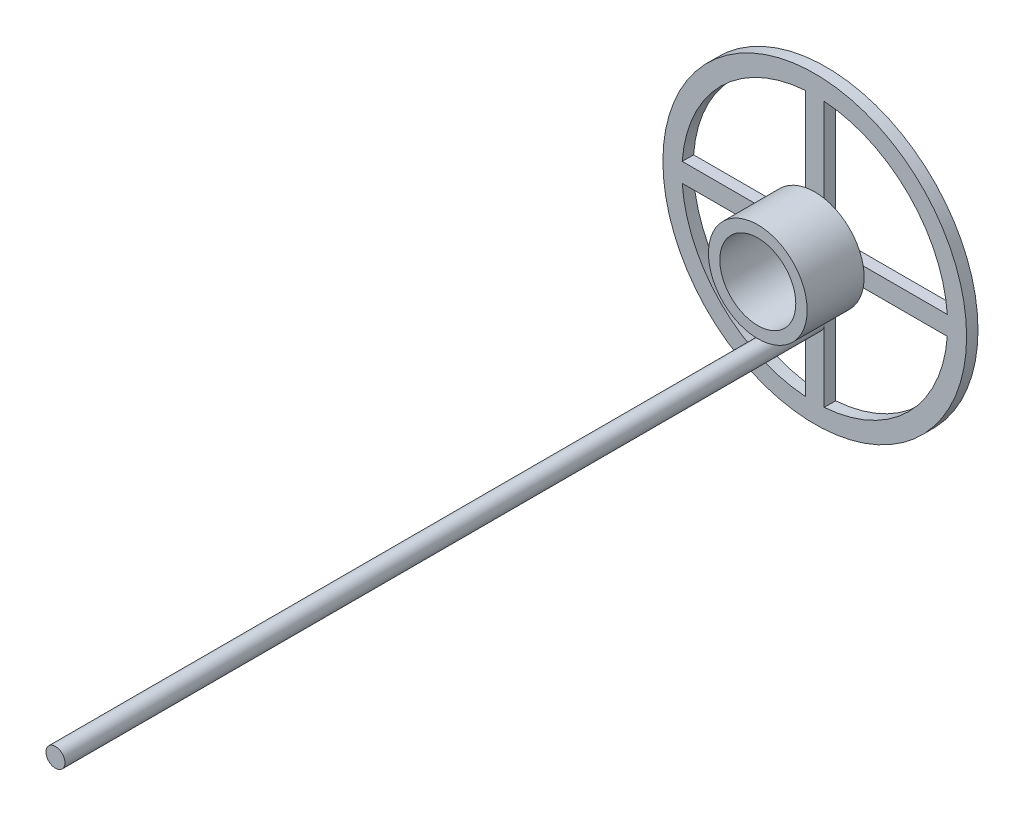
ISO-10303-21;
HEADER;
FILE_DESCRIPTION(('STEP AP214'),'2;1');
FILE_NAME('part.step','',(''),(''),'','','');
FILE_SCHEMA(('AUTOMOTIVE_DESIGN { 1 0 10303 214 1 1 1 1 }'));
ENDSEC;
DATA;
#1=APPLICATION_CONTEXT('core data for automotive mechanical design processes');
#2=APPLICATION_PROTOCOL_DEFINITION('international standard','automotive_design',2000,#1);
#3=PRODUCT_CONTEXT('',#1,'mechanical');
#4=PRODUCT('Part','Part','',(#3));
#5=PRODUCT_RELATED_PRODUCT_CATEGORY('part','',(#4));
#6=PRODUCT_DEFINITION_FORMATION('','',#4);
#7=PRODUCT_DEFINITION_CONTEXT('part definition',#1,'design');
#8=PRODUCT_DEFINITION('design','',#6,#7);
#9=PRODUCT_DEFINITION_SHAPE('','',#8);
#10=(LENGTH_UNIT() NAMED_UNIT(*) SI_UNIT(.MILLI.,.METRE.));
#11=(NAMED_UNIT(*) PLANE_ANGLE_UNIT() SI_UNIT($,.RADIAN.));
#12=(NAMED_UNIT(*) SI_UNIT($,.STERADIAN.) SOLID_ANGLE_UNIT());
#13=UNCERTAINTY_MEASURE_WITH_UNIT(LENGTH_MEASURE(1.E-05),#10,'distance_accuracy_value','');
#14=(GEOMETRIC_REPRESENTATION_CONTEXT(3) GLOBAL_UNCERTAINTY_ASSIGNED_CONTEXT((#13)) GLOBAL_UNIT_ASSIGNED_CONTEXT((#10,
#11,#12)) REPRESENTATION_CONTEXT('',''));
#15=CARTESIAN_POINT('',(0.,0.,0.));
#16=DIRECTION('',(0.,0.,1.));
#17=DIRECTION('',(1.,0.,0.));
#18=AXIS2_PLACEMENT_3D('',#15,#16,#17);
#19=CARTESIAN_POINT('',(0.,-160.,2030.));
#20=DIRECTION('',(0.,0.,-1.));
#21=DIRECTION('',(-1.,0.,0.));
#22=AXIS2_PLACEMENT_3D('',#19,#20,#21);
#23=CYLINDRICAL_SURFACE('',#22,25.);
#24=CARTESIAN_POINT('',(0.,-160.,2030.));
#25=DIRECTION('',(0.,0.,1.));
#26=DIRECTION('',(1.,0.,0.));
#27=AXIS2_PLACEMENT_3D('',#24,#25,#26);
#28=CIRCLE('',#27,25.);
#29=CARTESIAN_POINT('',(25.,-160.,2030.));
#30=VERTEX_POINT('',#29);
#31=EDGE_CURVE('E11',#30,#30,#28,.T.);
#32=ORIENTED_EDGE('',*,*,#31,.F.);
#33=EDGE_LOOP('',(#32));
#34=FACE_BOUND('',#33,.T.);
#35=CARTESIAN_POINT('',(0.,-160.,30.));
#36=DIRECTION('',(0.,0.,1.));
#37=DIRECTION('',(1.,0.,0.));
#38=AXIS2_PLACEMENT_3D('',#35,#36,#37);
#39=CIRCLE('',#38,25.);
#40=CARTESIAN_POINT('',(25.,-160.,30.));
#41=VERTEX_POINT('',#40);
#42=EDGE_CURVE('E52',#41,#41,#39,.T.);
#43=ORIENTED_EDGE('',*,*,#42,.T.);
#44=EDGE_LOOP('',(#43));
#45=FACE_BOUND('',#44,.T.);
#46=ADVANCED_FACE('F49',(#34,#45),#23,.T.);
#47=CARTESIAN_POINT('',(0.,-160.,2030.));
#48=DIRECTION('',(0.,0.,1.));
#49=DIRECTION('',(1.,0.,0.));
#50=AXIS2_PLACEMENT_3D('',#47,#48,#49);
#51=PLANE('',#50);
#52=ORIENTED_EDGE('',*,*,#31,.T.);
#53=EDGE_LOOP('',(#52));
#54=FACE_BOUND('',#53,.T.);
#55=ADVANCED_FACE('F64',(#54),#51,.T.);
#56=CARTESIAN_POINT('',(0.,-160.,30.));
#57=DIRECTION('',(0.,0.,1.));
#58=DIRECTION('',(1.,0.,0.));
#59=AXIS2_PLACEMENT_3D('',#56,#57,#58);
#60=PLANE('',#59);
#61=ORIENTED_EDGE('',*,*,#42,.F.);
#62=EDGE_LOOP('',(#61));
#63=FACE_BOUND('',#62,.T.);
#64=ADVANCED_FACE('F62',(#63),#60,.F.);
#65=CLOSED_SHELL('',(#46,#55,#64));
#66=MANIFOLD_SOLID_BREP('B2',#65);
#67=CARTESIAN_POINT('',(0.,0.,30.));
#68=DIRECTION('',(0.,0.,1.));
#69=DIRECTION('',(1.,0.,0.));
#70=AXIS2_PLACEMENT_3D('',#67,#68,#69);
#71=PLANE('',#70);
#72=DIRECTION('',(0.,-1.,0.));
#73=VECTOR('',#72,1.);
#74=CARTESIAN_POINT('',(25.,25.,30.));
#75=LINE('',#74,#73);
#76=CARTESIAN_POINT('',(25.,96.8245836551854,30.));
#77=VERTEX_POINT('',#76);
#78=CARTESIAN_POINT('',(25.,25.,30.));
#79=VERTEX_POINT('',#78);
#80=EDGE_CURVE('E394',#77,#79,#75,.T.);
#81=ORIENTED_EDGE('',*,*,#80,.F.);
#82=CARTESIAN_POINT('',(0.,0.,30.));
#83=DIRECTION('',(0.,0.,1.));
#84=DIRECTION('',(1.,0.,0.));
#85=AXIS2_PLACEMENT_3D('',#82,#83,#84);
#86=CIRCLE('',#85,100.);
#87=CARTESIAN_POINT('',(-25.,96.8245836551854,30.));
#88=VERTEX_POINT('',#87);
#89=EDGE_CURVE('E242',#77,#88,#86,.T.);
#90=ORIENTED_EDGE('',*,*,#89,.T.);
#91=DIRECTION('',(0.,1.,0.));
#92=VECTOR('',#91,1.);
#93=CARTESIAN_POINT('',(-25.,25.,30.));
#94=LINE('',#93,#92);
#95=CARTESIAN_POINT('',(-25.,25.,30.));
#96=VERTEX_POINT('',#95);
#97=EDGE_CURVE('E297',#96,#88,#94,.T.);
#98=ORIENTED_EDGE('',*,*,#97,.F.);
#99=DIRECTION('',(1.,0.,0.));
#100=VECTOR('',#99,1.);
#101=CARTESIAN_POINT('',(-25.,25.,30.));
#102=LINE('',#101,#100);
#103=CARTESIAN_POINT('',(-96.8245836551854,25.,30.));
#104=VERTEX_POINT('',#103);
#105=EDGE_CURVE('E290',#104,#96,#102,.T.);
#106=ORIENTED_EDGE('',*,*,#105,.F.);
#107=CARTESIAN_POINT('',(-96.8245836551854,-24.9999999999999,30.));
#108=VERTEX_POINT('',#107);
#109=EDGE_CURVE('E414',#104,#108,#86,.T.);
#110=ORIENTED_EDGE('',*,*,#109,.T.);
#111=DIRECTION('',(-1.,0.,0.));
#112=VECTOR('',#111,1.);
#113=CARTESIAN_POINT('',(-25.,-25.,30.));
#114=LINE('',#113,#112);
#115=CARTESIAN_POINT('',(-25.,-25.,30.));
#116=VERTEX_POINT('',#115);
#117=EDGE_CURVE('E354',#116,#108,#114,.T.);
#118=ORIENTED_EDGE('',*,*,#117,.F.);
#119=DIRECTION('',(0.,1.,0.));
#120=VECTOR('',#119,1.);
#121=CARTESIAN_POINT('',(-25.,-349.106001094224,30.));
#122=LINE('',#121,#120);
#123=CARTESIAN_POINT('',(-25.,-96.8245836551854,30.));
#124=VERTEX_POINT('',#123);
#125=EDGE_CURVE('E347',#124,#116,#122,.T.);
#126=ORIENTED_EDGE('',*,*,#125,.F.);
#127=CARTESIAN_POINT('',(25.,-96.8245836551854,30.));
#128=VERTEX_POINT('',#127);
#129=EDGE_CURVE('E376',#124,#128,#86,.T.);
#130=ORIENTED_EDGE('',*,*,#129,.T.);
#131=DIRECTION('',(0.,-1.,0.));
#132=VECTOR('',#131,1.);
#133=CARTESIAN_POINT('',(25.,-349.106001094224,30.));
#134=LINE('',#133,#132);
#135=CARTESIAN_POINT('',(25.,-25.,30.));
#136=VERTEX_POINT('',#135);
#137=EDGE_CURVE('E325',#136,#128,#134,.T.);
#138=ORIENTED_EDGE('',*,*,#137,.F.);
#139=DIRECTION('',(-1.,0.,0.));
#140=VECTOR('',#139,1.);
#141=CARTESIAN_POINT('',(349.106001094224,-24.9999999999999,30.));
#142=LINE('',#141,#140);
#143=CARTESIAN_POINT('',(96.8245836551854,-24.9999999999999,30.));
#144=VERTEX_POINT('',#143);
#145=EDGE_CURVE('E319',#144,#136,#142,.T.);
#146=ORIENTED_EDGE('',*,*,#145,.F.);
#147=CARTESIAN_POINT('',(96.8245836551854,25.,30.));
#148=VERTEX_POINT('',#147);
#149=EDGE_CURVE('E374',#144,#148,#86,.T.);
#150=ORIENTED_EDGE('',*,*,#149,.T.);
#151=DIRECTION('',(1.,0.,0.));
#152=VECTOR('',#151,1.);
#153=CARTESIAN_POINT('',(349.106001094224,25.,30.));
#154=LINE('',#153,#152);
#155=EDGE_CURVE('E262',#79,#148,#154,.T.);
#156=ORIENTED_EDGE('',*,*,#155,.F.);
#157=EDGE_LOOP('',(#81,#90,#98,#106,#110,#118,#126,#130,#138,#146,#150,#156));
#158=FACE_BOUND('',#157,.T.);
#159=ADVANCED_FACE('F90',(#158),#71,.T.);
#160=CARTESIAN_POINT('',(0.,0.,30.));
#161=DIRECTION('',(0.,0.,1.));
#162=DIRECTION('',(1.,0.,0.));
#163=AXIS2_PLACEMENT_3D('',#160,#161,#162);
#164=CIRCLE('',#163,130.);
#165=CARTESIAN_POINT('',(25.,127.573508221731,30.));
#166=VERTEX_POINT('',#165);
#167=CARTESIAN_POINT('',(-25.,127.573508221731,30.));
#168=VERTEX_POINT('',#167);
#169=EDGE_CURVE('E47',#166,#168,#164,.T.);
#170=ORIENTED_EDGE('',*,*,#169,.F.);
#171=CARTESIAN_POINT('',(25.0000000000001,349.106001094224,30.));
#172=VERTEX_POINT('',#171);
#173=EDGE_CURVE('E260',#172,#166,#75,.T.);
#174=ORIENTED_EDGE('',*,*,#173,.F.);
#175=CARTESIAN_POINT('',(0.,0.,30.));
#176=DIRECTION('',(0.,0.,1.));
#177=DIRECTION('',(1.,0.,0.));
#178=AXIS2_PLACEMENT_3D('',#175,#176,#177);
#179=CIRCLE('',#178,350.);
#180=CARTESIAN_POINT('',(349.106001094224,25.,30.));
#181=VERTEX_POINT('',#180);
#182=EDGE_CURVE('E256',#181,#172,#179,.T.);
#183=ORIENTED_EDGE('',*,*,#182,.F.);
#184=CARTESIAN_POINT('',(127.573508221731,25.,30.));
#185=VERTEX_POINT('',#184);
#186=EDGE_CURVE('E252',#185,#181,#154,.T.);
#187=ORIENTED_EDGE('',*,*,#186,.F.);
#188=CARTESIAN_POINT('',(127.573508221731,-24.9999999999999,30.));
#189=VERTEX_POINT('',#188);
#190=EDGE_CURVE('E230',#189,#185,#164,.T.);
#191=ORIENTED_EDGE('',*,*,#190,.F.);
#192=CARTESIAN_POINT('',(349.106001094224,-24.9999999999999,30.));
#193=VERTEX_POINT('',#192);
#194=EDGE_CURVE('E321',#193,#189,#142,.T.);
#195=ORIENTED_EDGE('',*,*,#194,.F.);
#196=CARTESIAN_POINT('',(0.,0.,30.));
#197=DIRECTION('',(0.,0.,1.));
#198=DIRECTION('',(1.,0.,0.));
#199=AXIS2_PLACEMENT_3D('',#196,#197,#198);
#200=CIRCLE('',#199,350.);
#201=CARTESIAN_POINT('',(25.,-349.106001094224,30.));
#202=VERTEX_POINT('',#201);
#203=EDGE_CURVE('E317',#202,#193,#200,.T.);
#204=ORIENTED_EDGE('',*,*,#203,.F.);
#205=CARTESIAN_POINT('',(25.,-127.573508221731,30.));
#206=VERTEX_POINT('',#205);
#207=EDGE_CURVE('E323',#206,#202,#134,.T.);
#208=ORIENTED_EDGE('',*,*,#207,.F.);
#209=CARTESIAN_POINT('',(-25.,-127.573508221731,30.));
#210=VERTEX_POINT('',#209);
#211=EDGE_CURVE('E241',#210,#206,#164,.T.);
#212=ORIENTED_EDGE('',*,*,#211,.F.);
#213=CARTESIAN_POINT('',(-25.,-349.106001094224,30.));
#214=VERTEX_POINT('',#213);
#215=EDGE_CURVE('E349',#214,#210,#122,.T.);
#216=ORIENTED_EDGE('',*,*,#215,.F.);
#217=CARTESIAN_POINT('',(0.,0.,30.));
#218=DIRECTION('',(0.,0.,1.));
#219=DIRECTION('',(1.,0.,0.));
#220=AXIS2_PLACEMENT_3D('',#217,#218,#219);
#221=CIRCLE('',#220,350.);
#222=CARTESIAN_POINT('',(-349.106001094224,-24.9999999999999,30.));
#223=VERTEX_POINT('',#222);
#224=EDGE_CURVE('E345',#223,#214,#221,.T.);
#225=ORIENTED_EDGE('',*,*,#224,.F.);
#226=CARTESIAN_POINT('',(-127.573508221731,-24.9999999999999,30.));
#227=VERTEX_POINT('',#226);
#228=EDGE_CURVE('E352',#227,#223,#114,.T.);
#229=ORIENTED_EDGE('',*,*,#228,.F.);
#230=CARTESIAN_POINT('',(-127.573508221731,25.,30.));
#231=VERTEX_POINT('',#230);
#232=EDGE_CURVE('E99',#231,#227,#164,.T.);
#233=ORIENTED_EDGE('',*,*,#232,.F.);
#234=CARTESIAN_POINT('',(-349.106001094224,24.9999999999999,30.));
#235=VERTEX_POINT('',#234);
#236=EDGE_CURVE('E292',#235,#231,#102,.T.);
#237=ORIENTED_EDGE('',*,*,#236,.F.);
#238=CARTESIAN_POINT('',(0.,0.,30.));
#239=DIRECTION('',(0.,0.,1.));
#240=DIRECTION('',(1.,0.,0.));
#241=AXIS2_PLACEMENT_3D('',#238,#239,#240);
#242=CIRCLE('',#241,350.);
#243=CARTESIAN_POINT('',(-25.0000000000001,349.106001094224,30.));
#244=VERTEX_POINT('',#243);
#245=EDGE_CURVE('E288',#244,#235,#242,.T.);
#246=ORIENTED_EDGE('',*,*,#245,.F.);
#247=EDGE_CURVE('E295',#168,#244,#94,.T.);
#248=ORIENTED_EDGE('',*,*,#247,.F.);
#249=EDGE_LOOP('',(#170,#174,#183,#187,#191,#195,#204,#208,#212,#216,#225,#229,#233,#237,#246,#248));
#250=FACE_BOUND('',#249,.T.);
#251=CARTESIAN_POINT('',(0.,0.,30.));
#252=DIRECTION('',(0.,0.,1.));
#253=DIRECTION('',(1.,0.,0.));
#254=AXIS2_PLACEMENT_3D('',#251,#252,#253);
#255=CIRCLE('',#254,400.);
#256=CARTESIAN_POINT('',(400.,0.,30.));
#257=VERTEX_POINT('',#256);
#258=EDGE_CURVE('E372',#257,#257,#255,.T.);
#259=ORIENTED_EDGE('',*,*,#258,.T.);
#260=EDGE_LOOP('',(#259));
#261=FACE_BOUND('',#260,.T.);
#262=ADVANCED_FACE('F253',(#250,#261),#71,.T.);
#263=CARTESIAN_POINT('',(0.,0.,0.));
#264=DIRECTION('',(0.,0.,1.));
#265=DIRECTION('',(1.,0.,0.));
#266=AXIS2_PLACEMENT_3D('',#263,#264,#265);
#267=PLANE('',#266);
#268=CARTESIAN_POINT('',(0.,0.,0.));
#269=DIRECTION('',(0.,0.,1.));
#270=DIRECTION('',(1.,0.,0.));
#271=AXIS2_PLACEMENT_3D('',#268,#269,#270);
#272=CIRCLE('',#271,350.);
#273=CARTESIAN_POINT('',(-25.0000000000001,349.106001094224,0.));
#274=VERTEX_POINT('',#273);
#275=CARTESIAN_POINT('',(-349.106001094224,24.9999999999999,0.));
#276=VERTEX_POINT('',#275);
#277=EDGE_CURVE('E287',#274,#276,#272,.T.);
#278=ORIENTED_EDGE('',*,*,#277,.T.);
#279=DIRECTION('',(1.,0.,0.));
#280=VECTOR('',#279,1.);
#281=CARTESIAN_POINT('',(-25.,25.,0.));
#282=LINE('',#281,#280);
#283=CARTESIAN_POINT('',(-25.,25.,0.));
#284=VERTEX_POINT('',#283);
#285=EDGE_CURVE('E304',#276,#284,#282,.T.);
#286=ORIENTED_EDGE('',*,*,#285,.T.);
#287=DIRECTION('',(0.,1.,0.));
#288=VECTOR('',#287,1.);
#289=CARTESIAN_POINT('',(-25.,25.,0.));
#290=LINE('',#289,#288);
#291=EDGE_CURVE('E291',#284,#274,#290,.T.);
#292=ORIENTED_EDGE('',*,*,#291,.T.);
#293=EDGE_LOOP('',(#278,#286,#292));
#294=FACE_BOUND('',#293,.T.);
#295=CARTESIAN_POINT('',(0.,0.,0.));
#296=DIRECTION('',(0.,0.,1.));
#297=DIRECTION('',(1.,0.,0.));
#298=AXIS2_PLACEMENT_3D('',#295,#296,#297);
#299=CIRCLE('',#298,350.);
#300=CARTESIAN_POINT('',(-349.106001094224,-24.9999999999999,0.));
#301=VERTEX_POINT('',#300);
#302=CARTESIAN_POINT('',(-25.,-349.106001094224,0.));
#303=VERTEX_POINT('',#302);
#304=EDGE_CURVE('E344',#301,#303,#299,.T.);
#305=ORIENTED_EDGE('',*,*,#304,.T.);
#306=DIRECTION('',(0.,1.,0.));
#307=VECTOR('',#306,1.);
#308=CARTESIAN_POINT('',(-25.,-349.106001094224,0.));
#309=LINE('',#308,#307);
#310=CARTESIAN_POINT('',(-25.,-25.,0.));
#311=VERTEX_POINT('',#310);
#312=EDGE_CURVE('E361',#303,#311,#309,.T.);
#313=ORIENTED_EDGE('',*,*,#312,.T.);
#314=DIRECTION('',(-1.,0.,0.));
#315=VECTOR('',#314,1.);
#316=CARTESIAN_POINT('',(-25.,-25.,0.));
#317=LINE('',#316,#315);
#318=EDGE_CURVE('E348',#311,#301,#317,.T.);
#319=ORIENTED_EDGE('',*,*,#318,.T.);
#320=EDGE_LOOP('',(#305,#313,#319));
#321=FACE_BOUND('',#320,.T.);
#322=CARTESIAN_POINT('',(0.,0.,0.));
#323=DIRECTION('',(0.,0.,1.));
#324=DIRECTION('',(1.,0.,0.));
#325=AXIS2_PLACEMENT_3D('',#322,#323,#324);
#326=CIRCLE('',#325,400.);
#327=CARTESIAN_POINT('',(400.,0.,0.));
#328=VERTEX_POINT('',#327);
#329=EDGE_CURVE('E94',#328,#328,#326,.T.);
#330=ORIENTED_EDGE('',*,*,#329,.F.);
#331=EDGE_LOOP('',(#330));
#332=FACE_BOUND('',#331,.T.);
#333=CARTESIAN_POINT('',(0.,0.,0.));
#334=DIRECTION('',(0.,0.,1.));
#335=DIRECTION('',(1.,0.,0.));
#336=AXIS2_PLACEMENT_3D('',#333,#334,#335);
#337=CIRCLE('',#336,350.);
#338=CARTESIAN_POINT('',(25.,-349.106001094224,0.));
#339=VERTEX_POINT('',#338);
#340=CARTESIAN_POINT('',(349.106001094224,-24.9999999999999,0.));
#341=VERTEX_POINT('',#340);
#342=EDGE_CURVE('E316',#339,#341,#337,.T.);
#343=ORIENTED_EDGE('',*,*,#342,.T.);
#344=DIRECTION('',(-1.,0.,0.));
#345=VECTOR('',#344,1.);
#346=CARTESIAN_POINT('',(349.106001094224,-24.9999999999999,0.));
#347=LINE('',#346,#345);
#348=CARTESIAN_POINT('',(25.,-25.,0.));
#349=VERTEX_POINT('',#348);
#350=EDGE_CURVE('E332',#341,#349,#347,.T.);
#351=ORIENTED_EDGE('',*,*,#350,.T.);
#352=DIRECTION('',(0.,-1.,0.));
#353=VECTOR('',#352,1.);
#354=CARTESIAN_POINT('',(25.,-349.106001094224,0.));
#355=LINE('',#354,#353);
#356=EDGE_CURVE('E320',#349,#339,#355,.T.);
#357=ORIENTED_EDGE('',*,*,#356,.T.);
#358=EDGE_LOOP('',(#343,#351,#357));
#359=FACE_BOUND('',#358,.T.);
#360=CARTESIAN_POINT('',(0.,0.,0.));
#361=DIRECTION('',(0.,0.,1.));
#362=DIRECTION('',(1.,0.,0.));
#363=AXIS2_PLACEMENT_3D('',#360,#361,#362);
#364=CIRCLE('',#363,350.);
#365=CARTESIAN_POINT('',(349.106001094224,25.,0.));
#366=VERTEX_POINT('',#365);
#367=CARTESIAN_POINT('',(25.0000000000001,349.106001094224,0.));
#368=VERTEX_POINT('',#367);
#369=EDGE_CURVE('E272',#366,#368,#364,.T.);
#370=ORIENTED_EDGE('',*,*,#369,.T.);
#371=DIRECTION('',(0.,-1.,0.));
#372=VECTOR('',#371,1.);
#373=CARTESIAN_POINT('',(25.,25.,0.));
#374=LINE('',#373,#372);
#375=CARTESIAN_POINT('',(25.,25.,0.));
#376=VERTEX_POINT('',#375);
#377=EDGE_CURVE('E275',#368,#376,#374,.T.);
#378=ORIENTED_EDGE('',*,*,#377,.T.);
#379=DIRECTION('',(1.,0.,0.));
#380=VECTOR('',#379,1.);
#381=CARTESIAN_POINT('',(349.106001094224,25.,0.));
#382=LINE('',#381,#380);
#383=EDGE_CURVE('E278',#376,#366,#382,.T.);
#384=ORIENTED_EDGE('',*,*,#383,.T.);
#385=EDGE_LOOP('',(#370,#378,#384));
#386=FACE_BOUND('',#385,.T.);
#387=ADVANCED_FACE('F382',(#294,#321,#332,#359,#386),#267,.F.);
#388=CARTESIAN_POINT('',(0.,0.,30.));
#389=DIRECTION('',(0.,0.,-1.));
#390=DIRECTION('',(-1.,0.,0.));
#391=AXIS2_PLACEMENT_3D('',#388,#389,#390);
#392=CYLINDRICAL_SURFACE('',#391,400.);
#393=ORIENTED_EDGE('',*,*,#258,.F.);
#394=EDGE_LOOP('',(#393));
#395=FACE_BOUND('',#394,.T.);
#396=ORIENTED_EDGE('',*,*,#329,.T.);
#397=EDGE_LOOP('',(#396));
#398=FACE_BOUND('',#397,.T.);
#399=ADVANCED_FACE('F92',(#395,#398),#392,.T.);
#400=CARTESIAN_POINT('',(0.,0.,30.));
#401=DIRECTION('',(0.,0.,-1.));
#402=DIRECTION('',(-1.,0.,0.));
#403=AXIS2_PLACEMENT_3D('',#400,#401,#402);
#404=CYLINDRICAL_SURFACE('',#403,350.);
#405=ORIENTED_EDGE('',*,*,#304,.F.);
#406=DIRECTION('',(0.,0.,-1.));
#407=VECTOR('',#406,1.);
#408=CARTESIAN_POINT('',(-349.106001094224,-24.9999999999999,30.));
#409=LINE('',#408,#407);
#410=EDGE_CURVE('E357',#223,#301,#409,.T.);
#411=ORIENTED_EDGE('',*,*,#410,.F.);
#412=ORIENTED_EDGE('',*,*,#224,.T.);
#413=DIRECTION('',(0.,0.,-1.));
#414=VECTOR('',#413,1.);
#415=CARTESIAN_POINT('',(-25.,-349.106001094224,30.));
#416=LINE('',#415,#414);
#417=EDGE_CURVE('E370',#214,#303,#416,.T.);
#418=ORIENTED_EDGE('',*,*,#417,.T.);
#419=EDGE_LOOP('',(#405,#411,#412,#418));
#420=FACE_BOUND('',#419,.T.);
#421=ADVANCED_FACE('F453',(#420),#404,.F.);
#422=CARTESIAN_POINT('',(-25.,-349.106001094224,30.));
#423=DIRECTION('',(-1.,0.,0.));
#424=DIRECTION('',(0.,-1.,0.));
#425=AXIS2_PLACEMENT_3D('',#422,#423,#424);
#426=PLANE('',#425);
#427=ORIENTED_EDGE('',*,*,#312,.F.);
#428=ORIENTED_EDGE('',*,*,#417,.F.);
#429=ORIENTED_EDGE('',*,*,#215,.T.);
#430=EDGE_CURVE('E353',#210,#124,#122,.T.);
#431=ORIENTED_EDGE('',*,*,#430,.T.);
#432=ORIENTED_EDGE('',*,*,#125,.T.);
#433=DIRECTION('',(0.,0.,-1.));
#434=VECTOR('',#433,1.);
#435=CARTESIAN_POINT('',(-25.,-25.,30.));
#436=LINE('',#435,#434);
#437=EDGE_CURVE('E368',#116,#311,#436,.T.);
#438=ORIENTED_EDGE('',*,*,#437,.T.);
#439=EDGE_LOOP('',(#427,#428,#429,#431,#432,#438));
#440=FACE_BOUND('',#439,.T.);
#441=ADVANCED_FACE('F443',(#440),#426,.T.);
#442=CARTESIAN_POINT('',(-25.,-25.,30.));
#443=DIRECTION('',(0.,-1.,0.));
#444=DIRECTION('',(1.,0.,0.));
#445=AXIS2_PLACEMENT_3D('',#442,#443,#444);
#446=PLANE('',#445);
#447=ORIENTED_EDGE('',*,*,#318,.F.);
#448=ORIENTED_EDGE('',*,*,#437,.F.);
#449=ORIENTED_EDGE('',*,*,#117,.T.);
#450=EDGE_CURVE('E358',#108,#227,#114,.T.);
#451=ORIENTED_EDGE('',*,*,#450,.T.);
#452=ORIENTED_EDGE('',*,*,#228,.T.);
#453=ORIENTED_EDGE('',*,*,#410,.T.);
#454=EDGE_LOOP('',(#447,#448,#449,#451,#452,#453));
#455=FACE_BOUND('',#454,.T.);
#456=ADVANCED_FACE('F434',(#455),#446,.T.);
#457=CARTESIAN_POINT('',(0.,0.,30.));
#458=DIRECTION('',(0.,0.,-1.));
#459=DIRECTION('',(-1.,0.,0.));
#460=AXIS2_PLACEMENT_3D('',#457,#458,#459);
#461=CYLINDRICAL_SURFACE('',#460,350.);
#462=ORIENTED_EDGE('',*,*,#342,.F.);
#463=DIRECTION('',(0.,0.,-1.));
#464=VECTOR('',#463,1.);
#465=CARTESIAN_POINT('',(25.,-349.106001094224,30.));
#466=LINE('',#465,#464);
#467=EDGE_CURVE('E328',#202,#339,#466,.T.);
#468=ORIENTED_EDGE('',*,*,#467,.F.);
#469=ORIENTED_EDGE('',*,*,#203,.T.);
#470=DIRECTION('',(0.,0.,-1.));
#471=VECTOR('',#470,1.);
#472=CARTESIAN_POINT('',(349.106001094224,-24.9999999999999,30.));
#473=LINE('',#472,#471);
#474=EDGE_CURVE('E341',#193,#341,#473,.T.);
#475=ORIENTED_EDGE('',*,*,#474,.T.);
#476=EDGE_LOOP('',(#462,#468,#469,#475));
#477=FACE_BOUND('',#476,.T.);
#478=ADVANCED_FACE('F432',(#477),#461,.F.);
#479=CARTESIAN_POINT('',(349.106001094224,-24.9999999999999,30.));
#480=DIRECTION('',(0.,-1.,0.));
#481=DIRECTION('',(1.,0.,0.));
#482=AXIS2_PLACEMENT_3D('',#479,#480,#481);
#483=PLANE('',#482);
#484=ORIENTED_EDGE('',*,*,#350,.F.);
#485=ORIENTED_EDGE('',*,*,#474,.F.);
#486=ORIENTED_EDGE('',*,*,#194,.T.);
#487=EDGE_CURVE('E324',#189,#144,#142,.T.);
#488=ORIENTED_EDGE('',*,*,#487,.T.);
#489=ORIENTED_EDGE('',*,*,#145,.T.);
#490=DIRECTION('',(0.,0.,-1.));
#491=VECTOR('',#490,1.);
#492=CARTESIAN_POINT('',(25.,-25.,30.));
#493=LINE('',#492,#491);
#494=EDGE_CURVE('E339',#136,#349,#493,.T.);
#495=ORIENTED_EDGE('',*,*,#494,.T.);
#496=EDGE_LOOP('',(#484,#485,#486,#488,#489,#495));
#497=FACE_BOUND('',#496,.T.);
#498=ADVANCED_FACE('F425',(#497),#483,.T.);
#499=CARTESIAN_POINT('',(25.,-349.106001094224,30.));
#500=DIRECTION('',(1.,0.,0.));
#501=DIRECTION('',(0.,1.,0.));
#502=AXIS2_PLACEMENT_3D('',#499,#500,#501);
#503=PLANE('',#502);
#504=ORIENTED_EDGE('',*,*,#356,.F.);
#505=ORIENTED_EDGE('',*,*,#494,.F.);
#506=ORIENTED_EDGE('',*,*,#137,.T.);
#507=EDGE_CURVE('E329',#128,#206,#134,.T.);
#508=ORIENTED_EDGE('',*,*,#507,.T.);
#509=ORIENTED_EDGE('',*,*,#207,.T.);
#510=ORIENTED_EDGE('',*,*,#467,.T.);
#511=EDGE_LOOP('',(#504,#505,#506,#508,#509,#510));
#512=FACE_BOUND('',#511,.T.);
#513=ADVANCED_FACE('F423',(#512),#503,.T.);
#514=CARTESIAN_POINT('',(0.,0.,30.));
#515=DIRECTION('',(0.,0.,-1.));
#516=DIRECTION('',(-1.,0.,0.));
#517=AXIS2_PLACEMENT_3D('',#514,#515,#516);
#518=CYLINDRICAL_SURFACE('',#517,350.);
#519=ORIENTED_EDGE('',*,*,#277,.F.);
#520=DIRECTION('',(0.,0.,-1.));
#521=VECTOR('',#520,1.);
#522=CARTESIAN_POINT('',(-25.0000000000001,349.106001094224,30.));
#523=LINE('',#522,#521);
#524=EDGE_CURVE('E300',#244,#274,#523,.T.);
#525=ORIENTED_EDGE('',*,*,#524,.F.);
#526=ORIENTED_EDGE('',*,*,#245,.T.);
#527=DIRECTION('',(0.,0.,-1.));
#528=VECTOR('',#527,1.);
#529=CARTESIAN_POINT('',(-349.106001094224,24.9999999999999,30.));
#530=LINE('',#529,#528);
#531=EDGE_CURVE('E313',#235,#276,#530,.T.);
#532=ORIENTED_EDGE('',*,*,#531,.T.);
#533=EDGE_LOOP('',(#519,#525,#526,#532));
#534=FACE_BOUND('',#533,.T.);
#535=ADVANCED_FACE('F488',(#534),#518,.F.);
#536=CARTESIAN_POINT('',(-25.,25.,30.));
#537=DIRECTION('',(0.,1.,0.));
#538=DIRECTION('',(-1.,0.,0.));
#539=AXIS2_PLACEMENT_3D('',#536,#537,#538);
#540=PLANE('',#539);
#541=ORIENTED_EDGE('',*,*,#285,.F.);
#542=ORIENTED_EDGE('',*,*,#531,.F.);
#543=ORIENTED_EDGE('',*,*,#236,.T.);
#544=EDGE_CURVE('E296',#231,#104,#102,.T.);
#545=ORIENTED_EDGE('',*,*,#544,.T.);
#546=ORIENTED_EDGE('',*,*,#105,.T.);
#547=DIRECTION('',(0.,0.,-1.));
#548=VECTOR('',#547,1.);
#549=CARTESIAN_POINT('',(-25.,25.,30.));
#550=LINE('',#549,#548);
#551=EDGE_CURVE('E311',#96,#284,#550,.T.);
#552=ORIENTED_EDGE('',*,*,#551,.T.);
#553=EDGE_LOOP('',(#541,#542,#543,#545,#546,#552));
#554=FACE_BOUND('',#553,.T.);
#555=ADVANCED_FACE('F486',(#554),#540,.T.);
#556=CARTESIAN_POINT('',(-25.,25.,30.));
#557=DIRECTION('',(-1.,0.,0.));
#558=DIRECTION('',(0.,-1.,0.));
#559=AXIS2_PLACEMENT_3D('',#556,#557,#558);
#560=PLANE('',#559);
#561=ORIENTED_EDGE('',*,*,#291,.F.);
#562=ORIENTED_EDGE('',*,*,#551,.F.);
#563=ORIENTED_EDGE('',*,*,#97,.T.);
#564=EDGE_CURVE('E301',#88,#168,#94,.T.);
#565=ORIENTED_EDGE('',*,*,#564,.T.);
#566=ORIENTED_EDGE('',*,*,#247,.T.);
#567=ORIENTED_EDGE('',*,*,#524,.T.);
#568=EDGE_LOOP('',(#561,#562,#563,#565,#566,#567));
#569=FACE_BOUND('',#568,.T.);
#570=ADVANCED_FACE('F493',(#569),#560,.T.);
#571=CARTESIAN_POINT('',(0.,0.,30.));
#572=DIRECTION('',(0.,0.,-1.));
#573=DIRECTION('',(-1.,0.,0.));
#574=AXIS2_PLACEMENT_3D('',#571,#572,#573);
#575=CYLINDRICAL_SURFACE('',#574,350.);
#576=ORIENTED_EDGE('',*,*,#369,.F.);
#577=DIRECTION('',(0.,0.,-1.));
#578=VECTOR('',#577,1.);
#579=CARTESIAN_POINT('',(349.106001094224,25.,30.));
#580=LINE('',#579,#578);
#581=EDGE_CURVE('E268',#181,#366,#580,.T.);
#582=ORIENTED_EDGE('',*,*,#581,.F.);
#583=ORIENTED_EDGE('',*,*,#182,.T.);
#584=DIRECTION('',(0.,0.,-1.));
#585=VECTOR('',#584,1.);
#586=CARTESIAN_POINT('',(25.0000000000001,349.106001094224,30.));
#587=LINE('',#586,#585);
#588=EDGE_CURVE('E284',#172,#368,#587,.T.);
#589=ORIENTED_EDGE('',*,*,#588,.T.);
#590=EDGE_LOOP('',(#576,#582,#583,#589));
#591=FACE_BOUND('',#590,.T.);
#592=ADVANCED_FACE('F388',(#591),#575,.F.);
#593=CARTESIAN_POINT('',(25.,25.,30.));
#594=DIRECTION('',(1.,0.,0.));
#595=DIRECTION('',(0.,1.,0.));
#596=AXIS2_PLACEMENT_3D('',#593,#594,#595);
#597=PLANE('',#596);
#598=ORIENTED_EDGE('',*,*,#377,.F.);
#599=ORIENTED_EDGE('',*,*,#588,.F.);
#600=ORIENTED_EDGE('',*,*,#173,.T.);
#601=EDGE_CURVE('E249',#166,#77,#75,.T.);
#602=ORIENTED_EDGE('',*,*,#601,.T.);
#603=ORIENTED_EDGE('',*,*,#80,.T.);
#604=DIRECTION('',(0.,0.,-1.));
#605=VECTOR('',#604,1.);
#606=CARTESIAN_POINT('',(25.,25.,30.));
#607=LINE('',#606,#605);
#608=EDGE_CURVE('E282',#79,#376,#607,.T.);
#609=ORIENTED_EDGE('',*,*,#608,.T.);
#610=EDGE_LOOP('',(#598,#599,#600,#602,#603,#609));
#611=FACE_BOUND('',#610,.T.);
#612=ADVANCED_FACE('F478',(#611),#597,.T.);
#613=CARTESIAN_POINT('',(349.106001094224,25.,30.));
#614=DIRECTION('',(0.,1.,0.));
#615=DIRECTION('',(-1.,0.,0.));
#616=AXIS2_PLACEMENT_3D('',#613,#614,#615);
#617=PLANE('',#616);
#618=ORIENTED_EDGE('',*,*,#383,.F.);
#619=ORIENTED_EDGE('',*,*,#608,.F.);
#620=ORIENTED_EDGE('',*,*,#155,.T.);
#621=EDGE_CURVE('E246',#148,#185,#154,.T.);
#622=ORIENTED_EDGE('',*,*,#621,.T.);
#623=ORIENTED_EDGE('',*,*,#186,.T.);
#624=ORIENTED_EDGE('',*,*,#581,.T.);
#625=EDGE_LOOP('',(#618,#619,#620,#622,#623,#624));
#626=FACE_BOUND('',#625,.T.);
#627=ADVANCED_FACE('F265',(#626),#617,.T.);
#628=CARTESIAN_POINT('',(0.,0.,30.));
#629=DIRECTION('',(0.,0.,1.));
#630=DIRECTION('',(1.,0.,0.));
#631=AXIS2_PLACEMENT_3D('',#628,#629,#630);
#632=PLANE('',#631);
#633=ORIENTED_EDGE('',*,*,#430,.F.);
#634=EDGE_CURVE('E474',#227,#210,#164,.T.);
#635=ORIENTED_EDGE('',*,*,#634,.F.);
#636=ORIENTED_EDGE('',*,*,#450,.F.);
#637=EDGE_CURVE('E406',#108,#124,#86,.T.);
#638=ORIENTED_EDGE('',*,*,#637,.T.);
#639=EDGE_LOOP('',(#633,#635,#636,#638));
#640=FACE_BOUND('',#639,.T.);
#641=ADVANCED_FACE('F472',(#640),#632,.F.);
#642=ORIENTED_EDGE('',*,*,#487,.F.);
#643=EDGE_CURVE('E236',#206,#189,#164,.T.);
#644=ORIENTED_EDGE('',*,*,#643,.F.);
#645=ORIENTED_EDGE('',*,*,#507,.F.);
#646=EDGE_CURVE('E400',#128,#144,#86,.T.);
#647=ORIENTED_EDGE('',*,*,#646,.T.);
#648=EDGE_LOOP('',(#642,#644,#645,#647));
#649=FACE_BOUND('',#648,.T.);
#650=ADVANCED_FACE('F403',(#649),#632,.F.);
#651=ORIENTED_EDGE('',*,*,#544,.F.);
#652=EDGE_CURVE('E101',#168,#231,#164,.T.);
#653=ORIENTED_EDGE('',*,*,#652,.F.);
#654=ORIENTED_EDGE('',*,*,#564,.F.);
#655=EDGE_CURVE('E114',#88,#104,#86,.T.);
#656=ORIENTED_EDGE('',*,*,#655,.T.);
#657=EDGE_LOOP('',(#651,#653,#654,#656));
#658=FACE_BOUND('',#657,.T.);
#659=ADVANCED_FACE('F494',(#658),#632,.F.);
#660=CARTESIAN_POINT('',(0.,0.,180.));
#661=DIRECTION('',(0.,0.,1.));
#662=DIRECTION('',(1.,0.,0.));
#663=AXIS2_PLACEMENT_3D('',#660,#661,#662);
#664=PLANE('',#663);
#665=CARTESIAN_POINT('',(0.,0.,180.));
#666=DIRECTION('',(0.,0.,1.));
#667=DIRECTION('',(1.,0.,0.));
#668=AXIS2_PLACEMENT_3D('',#665,#666,#667);
#669=CIRCLE('',#668,130.);
#670=CARTESIAN_POINT('',(130.,0.,180.));
#671=VERTEX_POINT('',#670);
#672=EDGE_CURVE('E250',#671,#671,#669,.T.);
#673=ORIENTED_EDGE('',*,*,#672,.T.);
#674=EDGE_LOOP('',(#673));
#675=FACE_BOUND('',#674,.T.);
#676=CARTESIAN_POINT('',(0.,0.,180.));
#677=DIRECTION('',(0.,0.,1.));
#678=DIRECTION('',(1.,0.,0.));
#679=AXIS2_PLACEMENT_3D('',#676,#677,#678);
#680=CIRCLE('',#679,100.);
#681=CARTESIAN_POINT('',(100.,0.,180.));
#682=VERTEX_POINT('',#681);
#683=EDGE_CURVE('E410',#682,#682,#680,.T.);
#684=ORIENTED_EDGE('',*,*,#683,.F.);
#685=EDGE_LOOP('',(#684));
#686=FACE_BOUND('',#685,.T.);
#687=ADVANCED_FACE('F496',(#675,#686),#664,.T.);
#688=ORIENTED_EDGE('',*,*,#601,.F.);
#689=EDGE_CURVE('E233',#185,#166,#164,.T.);
#690=ORIENTED_EDGE('',*,*,#689,.F.);
#691=ORIENTED_EDGE('',*,*,#621,.F.);
#692=EDGE_CURVE('E108',#148,#77,#86,.T.);
#693=ORIENTED_EDGE('',*,*,#692,.T.);
#694=EDGE_LOOP('',(#688,#690,#691,#693));
#695=FACE_BOUND('',#694,.T.);
#696=ADVANCED_FACE('F244',(#695),#632,.F.);
#697=CARTESIAN_POINT('',(0.,0.,180.));
#698=DIRECTION('',(0.,0.,-1.));
#699=DIRECTION('',(-1.,0.,0.));
#700=AXIS2_PLACEMENT_3D('',#697,#698,#699);
#701=CYLINDRICAL_SURFACE('',#700,130.);
#702=ORIENTED_EDGE('',*,*,#672,.F.);
#703=EDGE_LOOP('',(#702));
#704=FACE_BOUND('',#703,.T.);
#705=ORIENTED_EDGE('',*,*,#689,.T.);
#706=ORIENTED_EDGE('',*,*,#169,.T.);
#707=ORIENTED_EDGE('',*,*,#652,.T.);
#708=ORIENTED_EDGE('',*,*,#232,.T.);
#709=ORIENTED_EDGE('',*,*,#634,.T.);
#710=ORIENTED_EDGE('',*,*,#211,.T.);
#711=ORIENTED_EDGE('',*,*,#643,.T.);
#712=ORIENTED_EDGE('',*,*,#190,.T.);
#713=EDGE_LOOP('',(#705,#706,#707,#708,#709,#710,#711,#712));
#714=FACE_BOUND('',#713,.T.);
#715=ADVANCED_FACE('F232',(#704,#714),#701,.T.);
#716=CARTESIAN_POINT('',(0.,0.,180.));
#717=DIRECTION('',(0.,0.,-1.));
#718=DIRECTION('',(-1.,0.,0.));
#719=AXIS2_PLACEMENT_3D('',#716,#717,#718);
#720=CYLINDRICAL_SURFACE('',#719,100.);
#721=ORIENTED_EDGE('',*,*,#683,.T.);
#722=EDGE_LOOP('',(#721));
#723=FACE_BOUND('',#722,.T.);
#724=ORIENTED_EDGE('',*,*,#692,.F.);
#725=ORIENTED_EDGE('',*,*,#149,.F.);
#726=ORIENTED_EDGE('',*,*,#646,.F.);
#727=ORIENTED_EDGE('',*,*,#129,.F.);
#728=ORIENTED_EDGE('',*,*,#637,.F.);
#729=ORIENTED_EDGE('',*,*,#109,.F.);
#730=ORIENTED_EDGE('',*,*,#655,.F.);
#731=ORIENTED_EDGE('',*,*,#89,.F.);
#732=EDGE_LOOP('',(#724,#725,#726,#727,#728,#729,#730,#731));
#733=FACE_BOUND('',#732,.T.);
#734=ADVANCED_FACE('F399',(#723,#733),#720,.F.);
#735=CLOSED_SHELL('',(#159,#262,#387,#399,#421,#441,#456,#478,#498,#513,#535,#555,#570,#592,
#612,#627,#641,#650,#659,#687,#696,#715,#734));
#736=MANIFOLD_SOLID_BREP('B6',#735);
#737=ADVANCED_BREP_SHAPE_REPRESENTATION('',(#18,#66,#736),#14);
#738=SHAPE_DEFINITION_REPRESENTATION(#9,#737);
ENDSEC;
END-ISO-10303-21;
